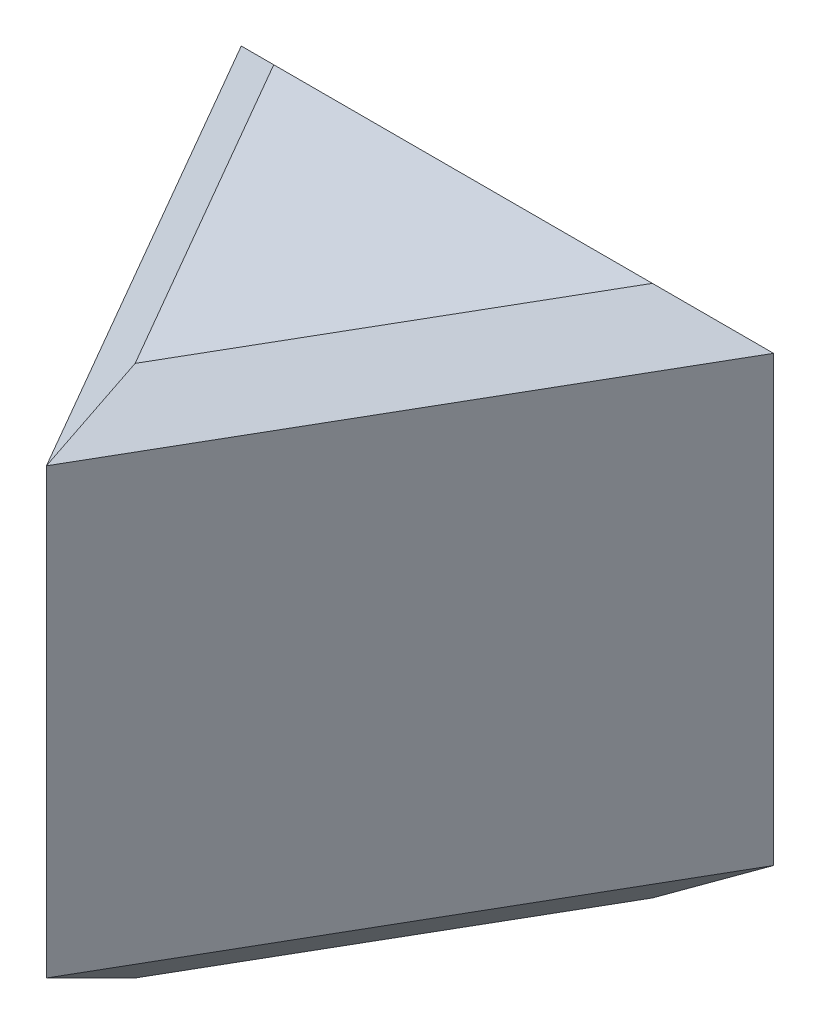
ISO-10303-21;
HEADER;
FILE_DESCRIPTION(('STEP AP214'),'2;1');
FILE_NAME('part.step','',(''),(''),'','','');
FILE_SCHEMA(('AUTOMOTIVE_DESIGN { 1 0 10303 214 1 1 1 1 }'));
ENDSEC;
DATA;
#1=APPLICATION_CONTEXT('core data for automotive mechanical design processes');
#2=APPLICATION_PROTOCOL_DEFINITION('international standard','automotive_design',2000,#1);
#3=PRODUCT_CONTEXT('',#1,'mechanical');
#4=PRODUCT('Part','Part','',(#3));
#5=PRODUCT_RELATED_PRODUCT_CATEGORY('part','',(#4));
#6=PRODUCT_DEFINITION_FORMATION('','',#4);
#7=PRODUCT_DEFINITION_CONTEXT('part definition',#1,'design');
#8=PRODUCT_DEFINITION('design','',#6,#7);
#9=PRODUCT_DEFINITION_SHAPE('','',#8);
#10=(LENGTH_UNIT() NAMED_UNIT(*) SI_UNIT(.MILLI.,.METRE.));
#11=(NAMED_UNIT(*) PLANE_ANGLE_UNIT() SI_UNIT($,.RADIAN.));
#12=(NAMED_UNIT(*) SI_UNIT($,.STERADIAN.) SOLID_ANGLE_UNIT());
#13=UNCERTAINTY_MEASURE_WITH_UNIT(LENGTH_MEASURE(1.E-05),#10,'distance_accuracy_value','');
#14=(GEOMETRIC_REPRESENTATION_CONTEXT(3) GLOBAL_UNCERTAINTY_ASSIGNED_CONTEXT((#13)) GLOBAL_UNIT_ASSIGNED_CONTEXT((#10,
#11,#12)) REPRESENTATION_CONTEXT('',''));
#15=CARTESIAN_POINT('',(0.,0.,0.));
#16=DIRECTION('',(0.,0.,1.));
#17=DIRECTION('',(1.,0.,0.));
#18=AXIS2_PLACEMENT_3D('',#15,#16,#17);
#19=CARTESIAN_POINT('',(-3.,3.,-1.73205080756888));
#20=DIRECTION('',(0.866025403784438,0.,-0.5));
#21=DIRECTION('',(-0.5,0.,-0.866025403784439));
#22=AXIS2_PLACEMENT_3D('',#19,#20,#21);
#23=PLANE('',#22);
#24=DIRECTION('',(0.,-1.,0.));
#25=VECTOR('',#24,1.);
#26=CARTESIAN_POINT('',(-3.,3.,-1.73205080756888));
#27=LINE('',#26,#25);
#28=CARTESIAN_POINT('',(-3.,2.5,-1.73205080756888));
#29=VERTEX_POINT('',#28);
#30=CARTESIAN_POINT('',(-3.,-2.5,-1.73205080756888));
#31=VERTEX_POINT('',#30);
#32=EDGE_CURVE('E110',#29,#31,#27,.T.);
#33=ORIENTED_EDGE('',*,*,#32,.T.);
#34=DIRECTION('',(0.5,0.,0.866025403784439));
#35=VECTOR('',#34,1.);
#36=CARTESIAN_POINT('',(-3.,-2.5,-1.73205080756888));
#37=LINE('',#36,#35);
#38=CARTESIAN_POINT('',(0.,-2.5,3.46410161513775));
#39=VERTEX_POINT('',#38);
#40=EDGE_CURVE('E132',#31,#39,#37,.T.);
#41=ORIENTED_EDGE('',*,*,#40,.T.);
#42=DIRECTION('',(0.,-1.,0.));
#43=VECTOR('',#42,1.);
#44=CARTESIAN_POINT('',(0.,3.,3.46410161513775));
#45=LINE('',#44,#43);
#46=CARTESIAN_POINT('',(0.,2.5,3.46410161513775));
#47=VERTEX_POINT('',#46);
#48=EDGE_CURVE('E102',#47,#39,#45,.T.);
#49=ORIENTED_EDGE('',*,*,#48,.F.);
#50=DIRECTION('',(-0.5,0.,-0.866025403784439));
#51=VECTOR('',#50,1.);
#52=CARTESIAN_POINT('',(-3.,2.5,-1.73205080756888));
#53=LINE('',#52,#51);
#54=EDGE_CURVE('E130',#47,#29,#53,.T.);
#55=ORIENTED_EDGE('',*,*,#54,.T.);
#56=EDGE_LOOP('',(#33,#41,#49,#55));
#57=FACE_BOUND('',#56,.T.);
#58=ADVANCED_FACE('F33',(#57),#23,.F.);
#59=CARTESIAN_POINT('',(0.,3.,3.46410161513775));
#60=DIRECTION('',(-0.866025403784439,0.,-0.5));
#61=DIRECTION('',(-0.5,0.,0.866025403784439));
#62=AXIS2_PLACEMENT_3D('',#59,#60,#61);
#63=PLANE('',#62);
#64=ORIENTED_EDGE('',*,*,#48,.T.);
#65=DIRECTION('',(0.5,0.,-0.866025403784439));
#66=VECTOR('',#65,1.);
#67=CARTESIAN_POINT('',(0.,-2.5,3.46410161513775));
#68=LINE('',#67,#66);
#69=CARTESIAN_POINT('',(3.,-2.5,-1.73205080756888));
#70=VERTEX_POINT('',#69);
#71=EDGE_CURVE('E101',#39,#70,#68,.T.);
#72=ORIENTED_EDGE('',*,*,#71,.T.);
#73=DIRECTION('',(0.,-1.,0.));
#74=VECTOR('',#73,1.);
#75=CARTESIAN_POINT('',(3.,3.,-1.73205080756888));
#76=LINE('',#75,#74);
#77=CARTESIAN_POINT('',(3.,2.5,-1.73205080756888));
#78=VERTEX_POINT('',#77);
#79=EDGE_CURVE('E108',#78,#70,#76,.T.);
#80=ORIENTED_EDGE('',*,*,#79,.F.);
#81=DIRECTION('',(-0.5,0.,0.866025403784439));
#82=VECTOR('',#81,1.);
#83=CARTESIAN_POINT('',(0.,2.5,3.46410161513775));
#84=LINE('',#83,#82);
#85=EDGE_CURVE('E94',#78,#47,#84,.T.);
#86=ORIENTED_EDGE('',*,*,#85,.T.);
#87=EDGE_LOOP('',(#64,#72,#80,#86));
#88=FACE_BOUND('',#87,.T.);
#89=ADVANCED_FACE('F115',(#88),#63,.F.);
#90=CARTESIAN_POINT('',(3.,3.,-1.73205080756888));
#91=DIRECTION('',(0.,0.,1.));
#92=DIRECTION('',(1.,0.,0.));
#93=AXIS2_PLACEMENT_3D('',#90,#91,#92);
#94=PLANE('',#93);
#95=ORIENTED_EDGE('',*,*,#79,.T.);
#96=DIRECTION('',(-1.,0.,0.));
#97=VECTOR('',#96,1.);
#98=CARTESIAN_POINT('',(3.,-2.5,-1.73205080756888));
#99=LINE('',#98,#97);
#100=EDGE_CURVE('E111',#70,#31,#99,.T.);
#101=ORIENTED_EDGE('',*,*,#100,.T.);
#102=ORIENTED_EDGE('',*,*,#32,.F.);
#103=DIRECTION('',(1.,0.,0.));
#104=VECTOR('',#103,1.);
#105=CARTESIAN_POINT('',(3.,2.5,-1.73205080756888));
#106=LINE('',#105,#104);
#107=EDGE_CURVE('E89',#29,#78,#106,.T.);
#108=ORIENTED_EDGE('',*,*,#107,.T.);
#109=EDGE_LOOP('',(#95,#101,#102,#108));
#110=FACE_BOUND('',#109,.T.);
#111=ADVANCED_FACE('F107',(#110),#94,.F.);
#112=CARTESIAN_POINT('',(0.,3.,0.));
#113=DIRECTION('',(0.,1.,0.));
#114=DIRECTION('',(0.,0.,1.));
#115=AXIS2_PLACEMENT_3D('',#112,#113,#114);
#116=PLANE('',#115);
#117=DIRECTION('',(0.5,0.,-0.866025403784439));
#118=VECTOR('',#117,1.);
#119=CARTESIAN_POINT('',(2.56698729810778,3.,-1.98205080756888));
#120=LINE('',#119,#118);
#121=CARTESIAN_POINT('',(0.,3.,2.46410161513776));
#122=VERTEX_POINT('',#121);
#123=CARTESIAN_POINT('',(2.13397459621557,3.,-1.23205080756888));
#124=VERTEX_POINT('',#123);
#125=EDGE_CURVE('E42',#122,#124,#120,.T.);
#126=ORIENTED_EDGE('',*,*,#125,.T.);
#127=DIRECTION('',(-1.,0.,0.));
#128=VECTOR('',#127,1.);
#129=CARTESIAN_POINT('',(-3.,3.,-1.23205080756888));
#130=LINE('',#129,#128);
#131=CARTESIAN_POINT('',(-2.13397459621556,3.,-1.23205080756888));
#132=VERTEX_POINT('',#131);
#133=EDGE_CURVE('E11',#124,#132,#130,.T.);
#134=ORIENTED_EDGE('',*,*,#133,.T.);
#135=DIRECTION('',(0.5,0.,0.866025403784439));
#136=VECTOR('',#135,1.);
#137=CARTESIAN_POINT('',(0.433012701892219,3.,3.21410161513776));
#138=LINE('',#137,#136);
#139=EDGE_CURVE('E52',#132,#122,#138,.T.);
#140=ORIENTED_EDGE('',*,*,#139,.T.);
#141=EDGE_LOOP('',(#126,#134,#140));
#142=FACE_BOUND('',#141,.T.);
#143=ADVANCED_FACE('F144',(#142),#116,.T.);
#144=CARTESIAN_POINT('',(0.,-3.,0.));
#145=DIRECTION('',(0.,1.,0.));
#146=DIRECTION('',(0.,0.,1.));
#147=AXIS2_PLACEMENT_3D('',#144,#145,#146);
#148=PLANE('',#147);
#149=DIRECTION('',(1.,0.,0.));
#150=VECTOR('',#149,1.);
#151=CARTESIAN_POINT('',(0.,-3.,-1.23205080756887));
#152=LINE('',#151,#150);
#153=CARTESIAN_POINT('',(-2.13397459621555,-3.,-1.23205080756887));
#154=VERTEX_POINT('',#153);
#155=CARTESIAN_POINT('',(2.13397459621556,-3.,-1.23205080756887));
#156=VERTEX_POINT('',#155);
#157=EDGE_CURVE('E125',#154,#156,#152,.T.);
#158=ORIENTED_EDGE('',*,*,#157,.T.);
#159=DIRECTION('',(-0.5,0.,0.866025403784439));
#160=VECTOR('',#159,1.);
#161=CARTESIAN_POINT('',(1.06698729810778,-3.,0.616025403784437));
#162=LINE('',#161,#160);
#163=CARTESIAN_POINT('',(0.,-3.,2.46410161513775));
#164=VERTEX_POINT('',#163);
#165=EDGE_CURVE('E112',#156,#164,#162,.T.);
#166=ORIENTED_EDGE('',*,*,#165,.T.);
#167=DIRECTION('',(-0.5,0.,-0.866025403784439));
#168=VECTOR('',#167,1.);
#169=CARTESIAN_POINT('',(-1.06698729810778,-3.,0.616025403784436));
#170=LINE('',#169,#168);
#171=EDGE_CURVE('E123',#164,#154,#170,.T.);
#172=ORIENTED_EDGE('',*,*,#171,.T.);
#173=EDGE_LOOP('',(#158,#166,#172));
#174=FACE_BOUND('',#173,.T.);
#175=ADVANCED_FACE('F146',(#174),#148,.F.);
#176=CARTESIAN_POINT('',(-3.,-2.5,-1.73205080756888));
#177=DIRECTION('',(0.612372435695793,0.707106781186549,-0.353553390593273));
#178=DIRECTION('',(0.5,0.,0.866025403784439));
#179=AXIS2_PLACEMENT_3D('',#176,#177,#178);
#180=PLANE('',#179);
#181=DIRECTION('',(0.,0.447213595499957,0.894427190999917));
#182=VECTOR('',#181,1.);
#183=CARTESIAN_POINT('',(0.,-4.57846096908264,-0.692820323027556));
#184=LINE('',#183,#182);
#185=EDGE_CURVE('E138',#39,#164,#184,.F.);
#186=ORIENTED_EDGE('',*,*,#185,.F.);
#187=ORIENTED_EDGE('',*,*,#40,.F.);
#188=DIRECTION('',(0.774596669241484,-0.447213595499956,0.447213595499958));
#189=VECTOR('',#188,1.);
#190=CARTESIAN_POINT('',(-3.,-2.5,-1.73205080756888));
#191=LINE('',#190,#189);
#192=EDGE_CURVE('E119',#154,#31,#191,.F.);
#193=ORIENTED_EDGE('',*,*,#192,.F.);
#194=ORIENTED_EDGE('',*,*,#171,.F.);
#195=EDGE_LOOP('',(#186,#187,#193,#194));
#196=FACE_BOUND('',#195,.T.);
#197=ADVANCED_FACE('F152',(#196),#180,.F.);
#198=CARTESIAN_POINT('',(3.,-2.5,-1.73205080756888));
#199=DIRECTION('',(0.,0.707106781186549,0.707106781186546));
#200=DIRECTION('',(-1.,0.,0.));
#201=AXIS2_PLACEMENT_3D('',#198,#199,#200);
#202=PLANE('',#201);
#203=ORIENTED_EDGE('',*,*,#192,.T.);
#204=ORIENTED_EDGE('',*,*,#100,.F.);
#205=DIRECTION('',(-0.774596669241484,-0.447213595499956,0.447213595499959));
#206=VECTOR('',#205,1.);
#207=CARTESIAN_POINT('',(3.,-2.5,-1.73205080756888));
#208=LINE('',#207,#206);
#209=EDGE_CURVE('E136',#156,#70,#208,.F.);
#210=ORIENTED_EDGE('',*,*,#209,.F.);
#211=ORIENTED_EDGE('',*,*,#157,.F.);
#212=EDGE_LOOP('',(#203,#204,#210,#211));
#213=FACE_BOUND('',#212,.T.);
#214=ADVANCED_FACE('F167',(#213),#202,.F.);
#215=CARTESIAN_POINT('',(0.,-2.5,3.46410161513775));
#216=DIRECTION('',(-0.612372435695793,0.707106781186549,-0.353553390593273));
#217=DIRECTION('',(0.5,0.,-0.866025403784439));
#218=AXIS2_PLACEMENT_3D('',#215,#216,#217);
#219=PLANE('',#218);
#220=ORIENTED_EDGE('',*,*,#185,.T.);
#221=ORIENTED_EDGE('',*,*,#165,.F.);
#222=ORIENTED_EDGE('',*,*,#209,.T.);
#223=ORIENTED_EDGE('',*,*,#71,.F.);
#224=EDGE_LOOP('',(#220,#221,#222,#223));
#225=FACE_BOUND('',#224,.T.);
#226=ADVANCED_FACE('F164',(#225),#219,.F.);
#227=CARTESIAN_POINT('',(1.06698729810778,3.,0.616025403784441));
#228=DIRECTION('',(0.612372435695796,0.707106781186546,0.353553390593275));
#229=DIRECTION('',(-0.5,0.,0.866025403784439));
#230=AXIS2_PLACEMENT_3D('',#227,#228,#229);
#231=PLANE('',#230);
#232=DIRECTION('',(-0.774596669241483,0.447213595499959,0.447213595499958));
#233=VECTOR('',#232,1.);
#234=CARTESIAN_POINT('',(0.85358983848623,3.73923048454133,-0.492820323027553));
#235=LINE('',#234,#233);
#236=EDGE_CURVE('E85',#124,#78,#235,.F.);
#237=ORIENTED_EDGE('',*,*,#236,.F.);
#238=ORIENTED_EDGE('',*,*,#125,.F.);
#239=DIRECTION('',(0.,0.44721359549996,-0.894427190999915));
#240=VECTOR('',#239,1.);
#241=CARTESIAN_POINT('',(0.,3.73923048454133,0.985640646055107));
#242=LINE('',#241,#240);
#243=EDGE_CURVE('E37',#47,#122,#242,.T.);
#244=ORIENTED_EDGE('',*,*,#243,.F.);
#245=ORIENTED_EDGE('',*,*,#85,.F.);
#246=EDGE_LOOP('',(#237,#238,#244,#245));
#247=FACE_BOUND('',#246,.T.);
#248=ADVANCED_FACE('F35',(#247),#231,.T.);
#249=CARTESIAN_POINT('',(-1.06698729810778,3.,0.61602540378444));
#250=DIRECTION('',(-0.612372435695796,0.707106781186546,0.353553390593275));
#251=DIRECTION('',(-0.5,0.,-0.866025403784439));
#252=AXIS2_PLACEMENT_3D('',#249,#250,#251);
#253=PLANE('',#252);
#254=ORIENTED_EDGE('',*,*,#243,.T.);
#255=ORIENTED_EDGE('',*,*,#139,.F.);
#256=DIRECTION('',(-0.774596669241483,-0.44721359549996,-0.447213595499957));
#257=VECTOR('',#256,1.);
#258=CARTESIAN_POINT('',(-0.853589838486228,3.73923048454133,-0.492820323027553));
#259=LINE('',#258,#257);
#260=EDGE_CURVE('E92',#29,#132,#259,.F.);
#261=ORIENTED_EDGE('',*,*,#260,.F.);
#262=ORIENTED_EDGE('',*,*,#54,.F.);
#263=EDGE_LOOP('',(#254,#255,#261,#262));
#264=FACE_BOUND('',#263,.T.);
#265=ADVANCED_FACE('F143',(#264),#253,.T.);
#266=CARTESIAN_POINT('',(0.,3.,-1.23205080756888));
#267=DIRECTION('',(0.,0.707106781186546,-0.707106781186549));
#268=DIRECTION('',(1.,0.,0.));
#269=AXIS2_PLACEMENT_3D('',#266,#267,#268);
#270=PLANE('',#269);
#271=ORIENTED_EDGE('',*,*,#236,.T.);
#272=ORIENTED_EDGE('',*,*,#107,.F.);
#273=ORIENTED_EDGE('',*,*,#260,.T.);
#274=ORIENTED_EDGE('',*,*,#133,.F.);
#275=EDGE_LOOP('',(#271,#272,#273,#274));
#276=FACE_BOUND('',#275,.T.);
#277=ADVANCED_FACE('F87',(#276),#270,.T.);
#278=CLOSED_SHELL('',(#58,#89,#111,#143,#175,#197,#214,#226,#248,#265,#277));
#279=MANIFOLD_SOLID_BREP('B2',#278);
#280=ADVANCED_BREP_SHAPE_REPRESENTATION('',(#18,#279),#14);
#281=SHAPE_DEFINITION_REPRESENTATION(#9,#280);
ENDSEC;
END-ISO-10303-21;
